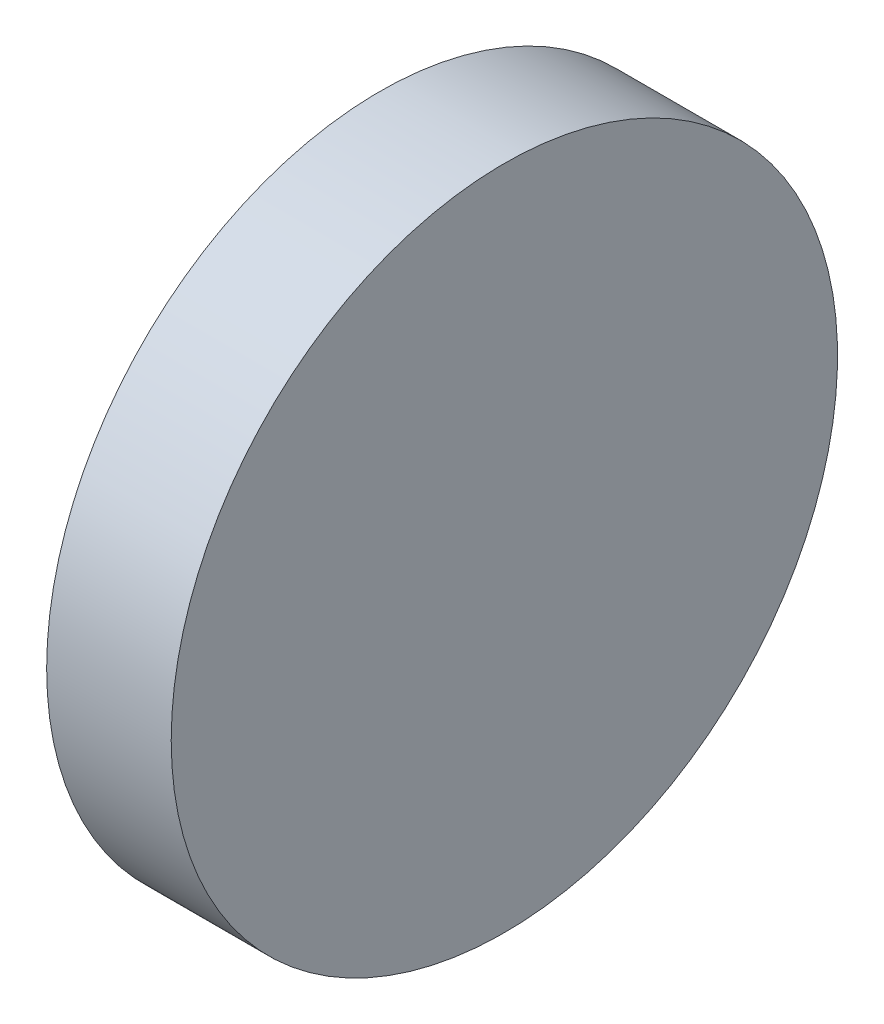
ISO-10303-21;
HEADER;
FILE_DESCRIPTION(('STEP AP214'),'2;1');
FILE_NAME('part.step','',(''),(''),'','','');
FILE_SCHEMA(('AUTOMOTIVE_DESIGN { 1 0 10303 214 1 1 1 1 }'));
ENDSEC;
DATA;
#1=APPLICATION_CONTEXT('core data for automotive mechanical design processes');
#2=APPLICATION_PROTOCOL_DEFINITION('international standard','automotive_design',2000,#1);
#3=PRODUCT_CONTEXT('',#1,'mechanical');
#4=PRODUCT('Part','Part','',(#3));
#5=PRODUCT_RELATED_PRODUCT_CATEGORY('part','',(#4));
#6=PRODUCT_DEFINITION_FORMATION('','',#4);
#7=PRODUCT_DEFINITION_CONTEXT('part definition',#1,'design');
#8=PRODUCT_DEFINITION('design','',#6,#7);
#9=PRODUCT_DEFINITION_SHAPE('','',#8);
#10=(LENGTH_UNIT() NAMED_UNIT(*) SI_UNIT(.MILLI.,.METRE.));
#11=(NAMED_UNIT(*) PLANE_ANGLE_UNIT() SI_UNIT($,.RADIAN.));
#12=(NAMED_UNIT(*) SI_UNIT($,.STERADIAN.) SOLID_ANGLE_UNIT());
#13=UNCERTAINTY_MEASURE_WITH_UNIT(LENGTH_MEASURE(1.E-05),#10,'distance_accuracy_value','');
#14=(GEOMETRIC_REPRESENTATION_CONTEXT(3) GLOBAL_UNCERTAINTY_ASSIGNED_CONTEXT((#13)) GLOBAL_UNIT_ASSIGNED_CONTEXT((#10,
#11,#12)) REPRESENTATION_CONTEXT('',''));
#15=CARTESIAN_POINT('',(0.,0.,0.));
#16=DIRECTION('',(0.,0.,1.));
#17=DIRECTION('',(1.,0.,0.));
#18=AXIS2_PLACEMENT_3D('',#15,#16,#17);
#19=CARTESIAN_POINT('',(4.7625,0.,0.));
#20=DIRECTION('',(-1.,0.,0.));
#21=DIRECTION('',(0.,0.,1.));
#22=AXIS2_PLACEMENT_3D('',#19,#20,#21);
#23=CYLINDRICAL_SURFACE('',#22,12.7381);
#24=CARTESIAN_POINT('',(4.7625,0.,0.));
#25=DIRECTION('',(1.,0.,0.));
#26=DIRECTION('',(0.,0.,-1.));
#27=AXIS2_PLACEMENT_3D('',#24,#25,#26);
#28=CIRCLE('',#27,12.7381);
#29=CARTESIAN_POINT('',(4.7625,0.,12.7381));
#30=VERTEX_POINT('',#29);
#31=EDGE_CURVE('E10',#30,#30,#28,.T.);
#32=CARTESIAN_POINT('',(0.,0.,0.));
#33=DIRECTION('',(1.,0.,0.));
#34=DIRECTION('',(0.,0.,-1.));
#35=AXIS2_PLACEMENT_3D('',#32,#33,#34);
#36=CIRCLE('',#35,12.7381);
#37=CARTESIAN_POINT('',(0.,0.,12.7381));
#38=VERTEX_POINT('',#37);
#39=EDGE_CURVE('E36',#38,#38,#36,.T.);
#40=CARTESIAN_POINT('',(4.7625,0.,12.7381));
#41=CARTESIAN_POINT('',(4.712890625,0.,12.7381));
#42=CARTESIAN_POINT('',(4.66328125,0.,12.7381));
#43=CARTESIAN_POINT('',(4.5640625,0.,12.7381));
#44=CARTESIAN_POINT('',(4.514453125,0.,12.7381));
#45=CARTESIAN_POINT('',(4.415234375,0.,12.7381));
#46=CARTESIAN_POINT('',(4.365625,0.,12.7381));
#47=CARTESIAN_POINT('',(4.26640625,0.,12.7381));
#48=CARTESIAN_POINT('',(4.216796875,0.,12.7381));
#49=CARTESIAN_POINT('',(4.117578125,0.,12.7381));
#50=CARTESIAN_POINT('',(4.06796875,0.,12.7381));
#51=CARTESIAN_POINT('',(3.96875,0.,12.7381));
#52=CARTESIAN_POINT('',(3.919140625,0.,12.7381));
#53=CARTESIAN_POINT('',(3.819921875,0.,12.7381));
#54=CARTESIAN_POINT('',(3.7703125,0.,12.7381));
#55=CARTESIAN_POINT('',(3.67109375,0.,12.7381));
#56=CARTESIAN_POINT('',(3.621484375,0.,12.7381));
#57=CARTESIAN_POINT('',(3.522265625,0.,12.7381));
#58=CARTESIAN_POINT('',(3.47265625,0.,12.7381));
#59=CARTESIAN_POINT('',(3.3734375,0.,12.7381));
#60=CARTESIAN_POINT('',(3.323828125,0.,12.7381));
#61=CARTESIAN_POINT('',(3.224609375,0.,12.7381));
#62=CARTESIAN_POINT('',(3.175,0.,12.7381));
#63=CARTESIAN_POINT('',(3.07578125,0.,12.7381));
#64=CARTESIAN_POINT('',(3.026171875,0.,12.7381));
#65=CARTESIAN_POINT('',(2.926953125,0.,12.7381));
#66=CARTESIAN_POINT('',(2.87734375,0.,12.7381));
#67=CARTESIAN_POINT('',(2.778125,0.,12.7381));
#68=CARTESIAN_POINT('',(2.728515625,0.,12.7381));
#69=CARTESIAN_POINT('',(2.629296875,0.,12.7381));
#70=CARTESIAN_POINT('',(2.5796875,0.,12.7381));
#71=CARTESIAN_POINT('',(2.48046875,0.,12.7381));
#72=CARTESIAN_POINT('',(2.430859375,0.,12.7381));
#73=CARTESIAN_POINT('',(2.331640625,0.,12.7381));
#74=CARTESIAN_POINT('',(2.28203125,0.,12.7381));
#75=CARTESIAN_POINT('',(2.1828125,0.,12.7381));
#76=CARTESIAN_POINT('',(2.133203125,0.,12.7381));
#77=CARTESIAN_POINT('',(2.033984375,0.,12.7381));
#78=CARTESIAN_POINT('',(1.984375,0.,12.7381));
#79=CARTESIAN_POINT('',(1.88515625,0.,12.7381));
#80=CARTESIAN_POINT('',(1.835546875,0.,12.7381));
#81=CARTESIAN_POINT('',(1.736328125,0.,12.7381));
#82=CARTESIAN_POINT('',(1.68671875,0.,12.7381));
#83=CARTESIAN_POINT('',(1.5875,0.,12.7381));
#84=CARTESIAN_POINT('',(1.537890625,0.,12.7381));
#85=CARTESIAN_POINT('',(1.438671875,0.,12.7381));
#86=CARTESIAN_POINT('',(1.3890625,0.,12.7381));
#87=CARTESIAN_POINT('',(1.28984375,0.,12.7381));
#88=CARTESIAN_POINT('',(1.240234375,0.,12.7381));
#89=CARTESIAN_POINT('',(1.141015625,0.,12.7381));
#90=CARTESIAN_POINT('',(1.09140625,0.,12.7381));
#91=CARTESIAN_POINT('',(0.9921875,0.,12.7381));
#92=CARTESIAN_POINT('',(0.942578125,0.,12.7381));
#93=CARTESIAN_POINT('',(0.843359375,0.,12.7381));
#94=CARTESIAN_POINT('',(0.79375,0.,12.7381));
#95=CARTESIAN_POINT('',(0.69453125,0.,12.7381));
#96=CARTESIAN_POINT('',(0.644921875,0.,12.7381));
#97=CARTESIAN_POINT('',(0.545703125,0.,12.7381));
#98=CARTESIAN_POINT('',(0.49609375,0.,12.7381));
#99=CARTESIAN_POINT('',(0.396875,0.,12.7381));
#100=CARTESIAN_POINT('',(0.347265625,0.,12.7381));
#101=CARTESIAN_POINT('',(0.248046875,0.,12.7381));
#102=CARTESIAN_POINT('',(0.1984375,0.,12.7381));
#103=CARTESIAN_POINT('',(0.09921875,0.,12.7381));
#104=CARTESIAN_POINT('',(0.049609375,0.,12.7381));
#105=CARTESIAN_POINT('',(0.,0.,12.7381));
#106=B_SPLINE_CURVE_WITH_KNOTS('',3,(#40,#41,#42,#43,#44,#45,#46,#47,#48,#49,#50,#51,#52,#53,
#54,#55,#56,#57,#58,#59,#60,#61,#62,#63,#64,#65,#66,#67,#68,#69,#70,#71,#72,#73,#74,#75,#76,#77,
#78,#79,#80,#81,#82,#83,#84,#85,#86,#87,#88,#89,#90,#91,#92,#93,#94,#95,#96,#97,#98,#99,#100,
#101,#102,#103,#104,#105),.UNSPECIFIED.,.F.,.F.,(4,2,2,2,2,2,2,2,2,2,2,2,2,2,2,2,2,2,2,2,2,2,2,
2,2,2,2,2,2,2,2,2,4),(0.,0.148828124999999,0.297656249999999,0.446484374999999,
0.595312499999999,0.744140625,0.89296875,1.041796875,1.190625,1.339453125,1.48828125,
1.637109375,1.7859375,1.934765625,2.08359375,2.232421875,2.38125,2.530078125,2.67890625,
2.827734375,2.9765625,3.125390625,3.27421875,3.423046875,3.571875,3.720703125,3.86953125,
4.018359375,4.1671875,4.316015625,4.46484375,4.613671875,4.7625),.UNSPECIFIED.);
#107=EDGE_CURVE('BSEAM33',#30,#38,#106,.T.);
#108=ORIENTED_EDGE('',*,*,#31,.F.);
#109=ORIENTED_EDGE('',*,*,#39,.T.);
#110=ORIENTED_EDGE('',*,*,#107,.T.);
#111=ORIENTED_EDGE('',*,*,#107,.F.);
#112=EDGE_LOOP('',(#108,#110,#109,#111));
#113=FACE_BOUND('',#112,.T.);
#114=ADVANCED_FACE('F33',(#113),#23,.T.);
#115=CARTESIAN_POINT('',(4.7625,0.,0.));
#116=DIRECTION('',(1.,0.,0.));
#117=DIRECTION('',(0.,0.,-1.));
#118=AXIS2_PLACEMENT_3D('',#115,#116,#117);
#119=PLANE('',#118);
#120=ORIENTED_EDGE('',*,*,#31,.T.);
#121=EDGE_LOOP('',(#120));
#122=FACE_BOUND('',#121,.T.);
#123=ADVANCED_FACE('F48',(#122),#119,.T.);
#124=CARTESIAN_POINT('',(0.,0.,0.));
#125=DIRECTION('',(1.,0.,0.));
#126=DIRECTION('',(0.,0.,-1.));
#127=AXIS2_PLACEMENT_3D('',#124,#125,#126);
#128=PLANE('',#127);
#129=ORIENTED_EDGE('',*,*,#39,.F.);
#130=EDGE_LOOP('',(#129));
#131=FACE_BOUND('',#130,.T.);
#132=ADVANCED_FACE('F46',(#131),#128,.F.);
#133=CLOSED_SHELL('',(#114,#123,#132));
#134=MANIFOLD_SOLID_BREP('B2',#133);
#135=ADVANCED_BREP_SHAPE_REPRESENTATION('',(#18,#134),#14);
#136=SHAPE_DEFINITION_REPRESENTATION(#9,#135);
ENDSEC;
END-ISO-10303-21;
